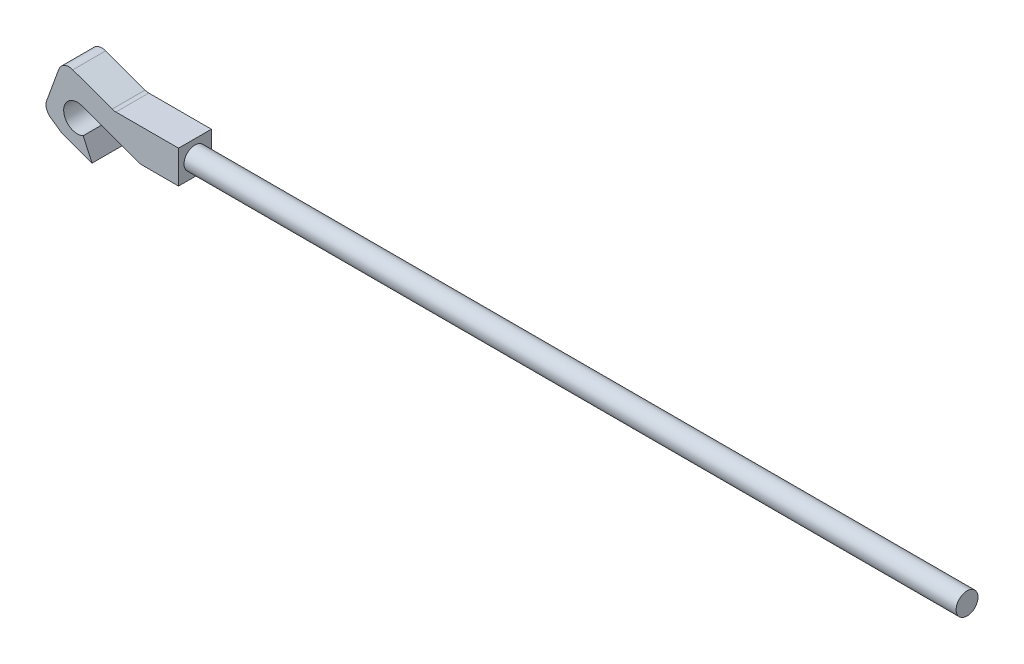
ISO-10303-21;
HEADER;
FILE_DESCRIPTION(('STEP AP214'),'2;1');
FILE_NAME('part.step','',(''),(''),'','','');
FILE_SCHEMA(('AUTOMOTIVE_DESIGN { 1 0 10303 214 1 1 1 1 }'));
ENDSEC;
DATA;
#1=APPLICATION_CONTEXT('core data for automotive mechanical design processes');
#2=APPLICATION_PROTOCOL_DEFINITION('international standard','automotive_design',2000,#1);
#3=PRODUCT_CONTEXT('',#1,'mechanical');
#4=PRODUCT('Part','Part','',(#3));
#5=PRODUCT_RELATED_PRODUCT_CATEGORY('part','',(#4));
#6=PRODUCT_DEFINITION_FORMATION('','',#4);
#7=PRODUCT_DEFINITION_CONTEXT('part definition',#1,'design');
#8=PRODUCT_DEFINITION('design','',#6,#7);
#9=PRODUCT_DEFINITION_SHAPE('','',#8);
#10=(LENGTH_UNIT() NAMED_UNIT(*) SI_UNIT(.MILLI.,.METRE.));
#11=(NAMED_UNIT(*) PLANE_ANGLE_UNIT() SI_UNIT($,.RADIAN.));
#12=(NAMED_UNIT(*) SI_UNIT($,.STERADIAN.) SOLID_ANGLE_UNIT());
#13=UNCERTAINTY_MEASURE_WITH_UNIT(LENGTH_MEASURE(1.E-05),#10,'distance_accuracy_value','');
#14=(GEOMETRIC_REPRESENTATION_CONTEXT(3) GLOBAL_UNCERTAINTY_ASSIGNED_CONTEXT((#13)) GLOBAL_UNIT_ASSIGNED_CONTEXT((#10,
#11,#12)) REPRESENTATION_CONTEXT('',''));
#15=CARTESIAN_POINT('',(0.,0.,0.));
#16=DIRECTION('',(0.,0.,1.));
#17=DIRECTION('',(1.,0.,0.));
#18=AXIS2_PLACEMENT_3D('',#15,#16,#17);
#19=CARTESIAN_POINT('',(-516.930591899167,74.9866588302387,-76.2));
#20=DIRECTION('',(1.,0.,0.));
#21=DIRECTION('',(0.,0.,-1.));
#22=AXIS2_PLACEMENT_3D('',#19,#20,#21);
#23=PLANE('',#22);
#24=CARTESIAN_POINT('',(-516.930591899167,-1.21334116976135,0.));
#25=DIRECTION('',(1.,0.,0.));
#26=DIRECTION('',(0.,0.,-1.));
#27=AXIS2_PLACEMENT_3D('',#24,#25,#26);
#28=CIRCLE('',#27,50.8);
#29=CARTESIAN_POINT('',(-516.930591899167,-1.21334116976135,50.8));
#30=VERTEX_POINT('',#29);
#31=EDGE_CURVE('E50',#30,#30,#28,.T.);
#32=ORIENTED_EDGE('',*,*,#31,.F.);
#33=EDGE_LOOP('',(#32));
#34=FACE_BOUND('',#33,.T.);
#35=DIRECTION('',(0.,1.,0.));
#36=VECTOR('',#35,1.);
#37=CARTESIAN_POINT('',(-516.930591899167,74.9866588302387,76.2));
#38=LINE('',#37,#36);
#39=CARTESIAN_POINT('',(-516.930591899167,-77.4133411697614,76.2));
#40=VERTEX_POINT('',#39);
#41=CARTESIAN_POINT('',(-516.930591899167,74.9866588302387,76.2));
#42=VERTEX_POINT('',#41);
#43=EDGE_CURVE('E188',#40,#42,#38,.T.);
#44=ORIENTED_EDGE('',*,*,#43,.F.);
#45=DIRECTION('',(0.,0.,1.));
#46=VECTOR('',#45,1.);
#47=CARTESIAN_POINT('',(-516.930591899167,-77.4133411697614,-76.2));
#48=LINE('',#47,#46);
#49=CARTESIAN_POINT('',(-516.930591899167,-77.4133411697614,-76.2));
#50=VERTEX_POINT('',#49);
#51=EDGE_CURVE('E64',#50,#40,#48,.T.);
#52=ORIENTED_EDGE('',*,*,#51,.F.);
#53=DIRECTION('',(0.,1.,0.));
#54=VECTOR('',#53,1.);
#55=CARTESIAN_POINT('',(-516.930591899167,74.9866588302387,-76.2));
#56=LINE('',#55,#54);
#57=CARTESIAN_POINT('',(-516.930591899167,74.9866588302387,-76.2));
#58=VERTEX_POINT('',#57);
#59=EDGE_CURVE('E241',#50,#58,#56,.T.);
#60=ORIENTED_EDGE('',*,*,#59,.T.);
#61=DIRECTION('',(0.,0.,1.));
#62=VECTOR('',#61,1.);
#63=CARTESIAN_POINT('',(-516.930591899167,74.9866588302387,-76.2));
#64=LINE('',#63,#62);
#65=EDGE_CURVE('E123',#58,#42,#64,.T.);
#66=ORIENTED_EDGE('',*,*,#65,.T.);
#67=EDGE_LOOP('',(#44,#52,#60,#66));
#68=FACE_BOUND('',#67,.T.);
#69=ADVANCED_FACE('F46',(#34,#68),#23,.T.);
#70=CARTESIAN_POINT('',(-516.930591899167,-77.4133411697614,-76.2));
#71=DIRECTION('',(0.,-1.,0.));
#72=DIRECTION('',(0.,0.,-1.));
#73=AXIS2_PLACEMENT_3D('',#70,#71,#72);
#74=PLANE('',#73);
#75=DIRECTION('',(1.,0.,0.));
#76=VECTOR('',#75,1.);
#77=CARTESIAN_POINT('',(-516.930591899167,-77.4133411697614,76.2));
#78=LINE('',#77,#76);
#79=CARTESIAN_POINT('',(-685.773181279177,-77.4133411697614,76.2));
#80=VERTEX_POINT('',#79);
#81=EDGE_CURVE('E237',#80,#40,#78,.T.);
#82=ORIENTED_EDGE('',*,*,#81,.F.);
#83=DIRECTION('',(0.,0.,1.));
#84=VECTOR('',#83,1.);
#85=CARTESIAN_POINT('',(-685.773181279177,-77.4133411697614,-76.2));
#86=LINE('',#85,#84);
#87=CARTESIAN_POINT('',(-685.773181279177,-77.4133411697614,-76.2));
#88=VERTEX_POINT('',#87);
#89=EDGE_CURVE('E111',#88,#80,#86,.T.);
#90=ORIENTED_EDGE('',*,*,#89,.F.);
#91=DIRECTION('',(1.,0.,0.));
#92=VECTOR('',#91,1.);
#93=CARTESIAN_POINT('',(-516.930591899167,-77.4133411697614,-76.2));
#94=LINE('',#93,#92);
#95=EDGE_CURVE('E174',#88,#50,#94,.T.);
#96=ORIENTED_EDGE('',*,*,#95,.T.);
#97=ORIENTED_EDGE('',*,*,#51,.T.);
#98=EDGE_LOOP('',(#82,#90,#96,#97));
#99=FACE_BOUND('',#98,.T.);
#100=ADVANCED_FACE('F280',(#99),#74,.T.);
#101=CARTESIAN_POINT('',(-685.773181279177,-26.6133411697613,-76.2));
#102=DIRECTION('',(0.,0.,1.));
#103=DIRECTION('',(1.,0.,0.));
#104=AXIS2_PLACEMENT_3D('',#101,#102,#103);
#105=CYLINDRICAL_SURFACE('',#104,50.8);
#106=CARTESIAN_POINT('',(-685.773181279177,-26.6133411697613,76.2));
#107=DIRECTION('',(0.,0.,1.));
#108=DIRECTION('',(-1.,0.,0.));
#109=AXIS2_PLACEMENT_3D('',#106,#107,#108);
#110=CIRCLE('',#109,50.8);
#111=CARTESIAN_POINT('',(-703.147804560121,-74.3497263056856,76.2));
#112=VERTEX_POINT('',#111);
#113=EDGE_CURVE('E160',#112,#80,#110,.T.);
#114=ORIENTED_EDGE('',*,*,#113,.F.);
#115=DIRECTION('',(0.,0.,1.));
#116=VECTOR('',#115,1.);
#117=CARTESIAN_POINT('',(-703.147804560121,-74.3497263056856,-76.2));
#118=LINE('',#117,#116);
#119=CARTESIAN_POINT('',(-703.147804560121,-74.3497263056856,-76.2));
#120=VERTEX_POINT('',#119);
#121=EDGE_CURVE('E155',#120,#112,#118,.T.);
#122=ORIENTED_EDGE('',*,*,#121,.F.);
#123=CARTESIAN_POINT('',(-685.773181279177,-26.6133411697613,-76.2));
#124=DIRECTION('',(0.,0.,1.));
#125=DIRECTION('',(-1.,0.,0.));
#126=AXIS2_PLACEMENT_3D('',#123,#124,#125);
#127=CIRCLE('',#126,50.8);
#128=EDGE_CURVE('E158',#120,#88,#127,.T.);
#129=ORIENTED_EDGE('',*,*,#128,.T.);
#130=ORIENTED_EDGE('',*,*,#89,.T.);
#131=EDGE_LOOP('',(#114,#122,#129,#130));
#132=FACE_BOUND('',#131,.T.);
#133=ADVANCED_FACE('F157',(#132),#105,.T.);
#134=CARTESIAN_POINT('',(-964.510784827192,20.7786188506314,-76.2));
#135=DIRECTION('',(-0.342020143325664,-0.93969262078591,0.));
#136=DIRECTION('',(0.93969262078591,-0.342020143325664,0.));
#137=AXIS2_PLACEMENT_3D('',#134,#135,#136);
#138=PLANE('',#137);
#139=DIRECTION('',(0.93969262078591,-0.342020143325664,0.));
#140=VECTOR('',#139,1.);
#141=CARTESIAN_POINT('',(-964.510784827192,20.7786188506314,76.2));
#142=LINE('',#141,#140);
#143=CARTESIAN_POINT('',(-964.510784827192,20.7786188506314,76.2));
#144=VERTEX_POINT('',#143);
#145=EDGE_CURVE('E232',#144,#112,#142,.T.);
#146=ORIENTED_EDGE('',*,*,#145,.F.);
#147=DIRECTION('',(0.,0.,1.));
#148=VECTOR('',#147,1.);
#149=CARTESIAN_POINT('',(-964.510784827192,20.7786188506314,-76.2));
#150=LINE('',#149,#148);
#151=CARTESIAN_POINT('',(-964.510784827192,20.7786188506314,-76.2));
#152=VERTEX_POINT('',#151);
#153=EDGE_CURVE('E166',#152,#144,#150,.T.);
#154=ORIENTED_EDGE('',*,*,#153,.F.);
#155=DIRECTION('',(0.93969262078591,-0.342020143325664,0.));
#156=VECTOR('',#155,1.);
#157=CARTESIAN_POINT('',(-964.510784827192,20.7786188506314,-76.2));
#158=LINE('',#157,#156);
#159=EDGE_CURVE('E172',#152,#120,#158,.T.);
#160=ORIENTED_EDGE('',*,*,#159,.T.);
#161=ORIENTED_EDGE('',*,*,#121,.T.);
#162=EDGE_LOOP('',(#146,#154,#160,#161));
#163=FACE_BOUND('',#162,.T.);
#164=ADVANCED_FACE('F177',(#163),#138,.T.);
#165=CARTESIAN_POINT('',(-986.229063928371,-38.891862569274,-76.2));
#166=DIRECTION('',(0.,0.,1.));
#167=DIRECTION('',(1.,0.,0.));
#168=AXIS2_PLACEMENT_3D('',#165,#166,#167);
#169=CYLINDRICAL_SURFACE('',#168,63.5000000000001);
#170=CARTESIAN_POINT('',(-986.229063928371,-38.891862569274,76.2));
#171=DIRECTION('',(0.,0.,-1.));
#172=DIRECTION('',(1.,0.,0.));
#173=AXIS2_PLACEMENT_3D('',#170,#171,#172);
#174=CIRCLE('',#173,63.5000000000001);
#175=CARTESIAN_POINT('',(-959.392804307836,-96.4424070461009,76.2));
#176=VERTEX_POINT('',#175);
#177=EDGE_CURVE('E228',#176,#144,#174,.T.);
#178=ORIENTED_EDGE('',*,*,#177,.F.);
#179=DIRECTION('',(0.,0.,1.));
#180=VECTOR('',#179,1.);
#181=CARTESIAN_POINT('',(-959.392804307836,-96.4424070461009,-76.2));
#182=LINE('',#181,#180);
#183=CARTESIAN_POINT('',(-959.392804307836,-96.4424070461009,-76.2));
#184=VERTEX_POINT('',#183);
#185=EDGE_CURVE('E248',#184,#176,#182,.T.);
#186=ORIENTED_EDGE('',*,*,#185,.F.);
#187=CARTESIAN_POINT('',(-986.229063928371,-38.891862569274,-76.2));
#188=DIRECTION('',(0.,0.,-1.));
#189=DIRECTION('',(1.,0.,0.));
#190=AXIS2_PLACEMENT_3D('',#187,#188,#189);
#191=CIRCLE('',#190,63.5000000000001);
#192=EDGE_CURVE('E179',#184,#152,#191,.T.);
#193=ORIENTED_EDGE('',*,*,#192,.T.);
#194=ORIENTED_EDGE('',*,*,#153,.T.);
#195=EDGE_LOOP('',(#178,#186,#193,#194));
#196=FACE_BOUND('',#195,.T.);
#197=ADVANCED_FACE('F295',(#196),#169,.F.);
#198=CARTESIAN_POINT('',(-917.815363486112,-185.605516625364,-76.2));
#199=DIRECTION('',(0.906307787036645,0.422618261740709,0.));
#200=DIRECTION('',(-0.422618261740709,0.906307787036646,0.));
#201=AXIS2_PLACEMENT_3D('',#198,#199,#200);
#202=PLANE('',#201);
#203=DIRECTION('',(-0.422618261740709,0.906307787036645,0.));
#204=VECTOR('',#203,1.);
#205=CARTESIAN_POINT('',(-917.815363486112,-185.605516625364,76.2));
#206=LINE('',#205,#204);
#207=CARTESIAN_POINT('',(-917.815363486112,-185.605516625364,76.2));
#208=VERTEX_POINT('',#207);
#209=EDGE_CURVE('E224',#208,#176,#206,.T.);
#210=ORIENTED_EDGE('',*,*,#209,.F.);
#211=DIRECTION('',(0.,0.,1.));
#212=VECTOR('',#211,1.);
#213=CARTESIAN_POINT('',(-917.815363486112,-185.605516625364,-76.2));
#214=LINE('',#213,#212);
#215=CARTESIAN_POINT('',(-917.815363486112,-185.605516625364,-76.2));
#216=VERTEX_POINT('',#215);
#217=EDGE_CURVE('E251',#216,#208,#214,.T.);
#218=ORIENTED_EDGE('',*,*,#217,.F.);
#219=DIRECTION('',(-0.422618261740709,0.906307787036645,0.));
#220=VECTOR('',#219,1.);
#221=CARTESIAN_POINT('',(-917.815363486112,-185.605516625364,-76.2));
#222=LINE('',#221,#220);
#223=EDGE_CURVE('E182',#216,#184,#222,.T.);
#224=ORIENTED_EDGE('',*,*,#223,.T.);
#225=ORIENTED_EDGE('',*,*,#185,.T.);
#226=EDGE_LOOP('',(#210,#218,#224,#225));
#227=FACE_BOUND('',#226,.T.);
#228=ADVANCED_FACE('F298',(#227),#202,.T.);
#229=CARTESIAN_POINT('',(-1061.02451889388,-133.481646782533,-76.2));
#230=DIRECTION('',(-0.342020143325663,-0.93969262078591,0.));
#231=DIRECTION('',(0.93969262078591,-0.342020143325664,0.));
#232=AXIS2_PLACEMENT_3D('',#229,#230,#231);
#233=PLANE('',#232);
#234=DIRECTION('',(0.93969262078591,-0.342020143325663,0.));
#235=VECTOR('',#234,1.);
#236=CARTESIAN_POINT('',(-1061.02451889388,-133.481646782533,76.2));
#237=LINE('',#236,#235);
#238=CARTESIAN_POINT('',(-1061.02451889388,-133.481646782533,76.2));
#239=VERTEX_POINT('',#238);
#240=EDGE_CURVE('E220',#239,#208,#237,.T.);
#241=ORIENTED_EDGE('',*,*,#240,.F.);
#242=DIRECTION('',(0.,0.,1.));
#243=VECTOR('',#242,1.);
#244=CARTESIAN_POINT('',(-1061.02451889388,-133.481646782533,-76.2));
#245=LINE('',#244,#243);
#246=CARTESIAN_POINT('',(-1061.02451889388,-133.481646782533,-76.2));
#247=VERTEX_POINT('',#246);
#248=EDGE_CURVE('E254',#247,#239,#245,.T.);
#249=ORIENTED_EDGE('',*,*,#248,.F.);
#250=DIRECTION('',(0.93969262078591,-0.342020143325663,0.));
#251=VECTOR('',#250,1.);
#252=CARTESIAN_POINT('',(-1061.02451889388,-133.481646782533,-76.2));
#253=LINE('',#252,#251);
#254=EDGE_CURVE('E478',#247,#216,#253,.T.);
#255=ORIENTED_EDGE('',*,*,#254,.T.);
#256=ORIENTED_EDGE('',*,*,#217,.T.);
#257=EDGE_LOOP('',(#241,#249,#255,#256));
#258=FACE_BOUND('',#257,.T.);
#259=ADVANCED_FACE('F302',(#258),#233,.T.);
#260=CARTESIAN_POINT('',(-1110.0119461331,-99.1802809521365,-76.2));
#261=DIRECTION('',(-0.573576436351042,-0.819152044288995,0.));
#262=DIRECTION('',(0.819152044288995,-0.573576436351042,0.));
#263=AXIS2_PLACEMENT_3D('',#260,#261,#262);
#264=PLANE('',#263);
#265=DIRECTION('',(0.819152044288995,-0.573576436351042,0.));
#266=VECTOR('',#265,1.);
#267=CARTESIAN_POINT('',(-1110.0119461331,-99.1802809521365,76.2));
#268=LINE('',#267,#266);
#269=CARTESIAN_POINT('',(-1110.0119461331,-99.1802809521365,76.2));
#270=VERTEX_POINT('',#269);
#271=EDGE_CURVE('E216',#270,#239,#268,.T.);
#272=ORIENTED_EDGE('',*,*,#271,.F.);
#273=DIRECTION('',(0.,0.,1.));
#274=VECTOR('',#273,1.);
#275=CARTESIAN_POINT('',(-1110.0119461331,-99.1802809521365,-76.2));
#276=LINE('',#275,#274);
#277=CARTESIAN_POINT('',(-1110.0119461331,-99.1802809521365,-76.2));
#278=VERTEX_POINT('',#277);
#279=EDGE_CURVE('E257',#278,#270,#276,.T.);
#280=ORIENTED_EDGE('',*,*,#279,.F.);
#281=DIRECTION('',(0.819152044288995,-0.573576436351042,0.));
#282=VECTOR('',#281,1.);
#283=CARTESIAN_POINT('',(-1110.0119461331,-99.1802809521365,-76.2));
#284=LINE('',#283,#282);
#285=EDGE_CURVE('E471',#278,#247,#284,.T.);
#286=ORIENTED_EDGE('',*,*,#285,.T.);
#287=ORIENTED_EDGE('',*,*,#248,.T.);
#288=EDGE_LOOP('',(#272,#280,#286,#287));
#289=FACE_BOUND('',#288,.T.);
#290=ADVANCED_FACE('F306',(#289),#264,.T.);
#291=CARTESIAN_POINT('',(-1080.87426316646,-57.5673571022556,-76.2));
#292=DIRECTION('',(0.,0.,1.));
#293=DIRECTION('',(1.,0.,0.));
#294=AXIS2_PLACEMENT_3D('',#291,#292,#293);
#295=CYLINDRICAL_SURFACE('',#294,50.8);
#296=CARTESIAN_POINT('',(-1080.87426316646,-57.5673571022556,76.2));
#297=DIRECTION('',(0.,0.,1.));
#298=DIRECTION('',(1.,0.,0.));
#299=AXIS2_PLACEMENT_3D('',#296,#297,#298);
#300=CIRCLE('',#299,50.8);
#301=CARTESIAN_POINT('',(-1128.61064830239,-40.1927338213119,76.2));
#302=VERTEX_POINT('',#301);
#303=EDGE_CURVE('E212',#302,#270,#300,.T.);
#304=ORIENTED_EDGE('',*,*,#303,.F.);
#305=DIRECTION('',(0.,0.,1.));
#306=VECTOR('',#305,1.);
#307=CARTESIAN_POINT('',(-1128.61064830239,-40.1927338213119,-76.2));
#308=LINE('',#307,#306);
#309=CARTESIAN_POINT('',(-1128.61064830239,-40.1927338213119,-76.2));
#310=VERTEX_POINT('',#309);
#311=EDGE_CURVE('E260',#310,#302,#308,.T.);
#312=ORIENTED_EDGE('',*,*,#311,.F.);
#313=CARTESIAN_POINT('',(-1080.87426316646,-57.5673571022556,-76.2));
#314=DIRECTION('',(0.,0.,1.));
#315=DIRECTION('',(1.,0.,0.));
#316=AXIS2_PLACEMENT_3D('',#313,#314,#315);
#317=CIRCLE('',#316,50.8);
#318=EDGE_CURVE('E467',#310,#278,#317,.T.);
#319=ORIENTED_EDGE('',*,*,#318,.T.);
#320=ORIENTED_EDGE('',*,*,#279,.T.);
#321=EDGE_LOOP('',(#304,#312,#319,#320));
#322=FACE_BOUND('',#321,.T.);
#323=ADVANCED_FACE('F310',(#322),#295,.T.);
#324=CARTESIAN_POINT('',(-1072.44417252805,114.123390099033,-76.2));
#325=DIRECTION('',(-0.93969262078591,0.342020143325663,0.));
#326=DIRECTION('',(-0.342020143325663,-0.93969262078591,0.));
#327=AXIS2_PLACEMENT_3D('',#324,#325,#326);
#328=PLANE('',#327);
#329=DIRECTION('',(-0.342020143325663,-0.93969262078591,0.));
#330=VECTOR('',#329,1.);
#331=CARTESIAN_POINT('',(-1072.44417252805,114.123390099033,76.2));
#332=LINE('',#331,#330);
#333=CARTESIAN_POINT('',(-1072.44417252805,114.123390099033,76.2));
#334=VERTEX_POINT('',#333);
#335=EDGE_CURVE('E208',#334,#302,#332,.T.);
#336=ORIENTED_EDGE('',*,*,#335,.F.);
#337=DIRECTION('',(0.,0.,1.));
#338=VECTOR('',#337,1.);
#339=CARTESIAN_POINT('',(-1072.44417252805,114.123390099033,-76.2));
#340=LINE('',#339,#338);
#341=CARTESIAN_POINT('',(-1072.44417252805,114.123390099033,-76.2));
#342=VERTEX_POINT('',#341);
#343=EDGE_CURVE('E263',#342,#334,#340,.T.);
#344=ORIENTED_EDGE('',*,*,#343,.F.);
#345=DIRECTION('',(-0.342020143325663,-0.93969262078591,0.));
#346=VECTOR('',#345,1.);
#347=CARTESIAN_POINT('',(-1072.44417252805,114.123390099033,-76.2));
#348=LINE('',#347,#346);
#349=EDGE_CURVE('E487',#342,#310,#348,.T.);
#350=ORIENTED_EDGE('',*,*,#349,.T.);
#351=ORIENTED_EDGE('',*,*,#311,.T.);
#352=EDGE_LOOP('',(#336,#344,#350,#351));
#353=FACE_BOUND('',#352,.T.);
#354=ADVANCED_FACE('F314',(#353),#328,.T.);
#355=CARTESIAN_POINT('',(-1024.70778739213,96.7487668180891,-76.2));
#356=DIRECTION('',(0.,0.,1.));
#357=DIRECTION('',(1.,0.,0.));
#358=AXIS2_PLACEMENT_3D('',#355,#356,#357);
#359=CYLINDRICAL_SURFACE('',#358,50.8);
#360=CARTESIAN_POINT('',(-1024.70778739213,96.7487668180891,76.2));
#361=DIRECTION('',(0.,0.,1.));
#362=DIRECTION('',(1.,0.,0.));
#363=AXIS2_PLACEMENT_3D('',#360,#361,#362);
#364=CIRCLE('',#363,50.8);
#365=CARTESIAN_POINT('',(-1007.33316411118,144.485151954013,76.2));
#366=VERTEX_POINT('',#365);
#367=EDGE_CURVE('E204',#366,#334,#364,.T.);
#368=ORIENTED_EDGE('',*,*,#367,.F.);
#369=DIRECTION('',(0.,0.,1.));
#370=VECTOR('',#369,1.);
#371=CARTESIAN_POINT('',(-1007.33316411118,144.485151954013,-76.2));
#372=LINE('',#371,#370);
#373=CARTESIAN_POINT('',(-1007.33316411118,144.485151954013,-76.2));
#374=VERTEX_POINT('',#373);
#375=EDGE_CURVE('E266',#374,#366,#372,.T.);
#376=ORIENTED_EDGE('',*,*,#375,.F.);
#377=CARTESIAN_POINT('',(-1024.70778739213,96.7487668180891,-76.2));
#378=DIRECTION('',(0.,0.,1.));
#379=DIRECTION('',(1.,0.,0.));
#380=AXIS2_PLACEMENT_3D('',#377,#378,#379);
#381=CIRCLE('',#380,50.8);
#382=EDGE_CURVE('E460',#374,#342,#381,.T.);
#383=ORIENTED_EDGE('',*,*,#382,.T.);
#384=ORIENTED_EDGE('',*,*,#343,.T.);
#385=EDGE_LOOP('',(#368,#376,#383,#384));
#386=FACE_BOUND('',#385,.T.);
#387=ADVANCED_FACE('F318',(#386),#359,.T.);
#388=CARTESIAN_POINT('',(-824.804836228439,78.0502736943145,-76.2));
#389=DIRECTION('',(0.342020143325664,0.93969262078591,0.));
#390=DIRECTION('',(-0.93969262078591,0.342020143325664,0.));
#391=AXIS2_PLACEMENT_3D('',#388,#389,#390);
#392=PLANE('',#391);
#393=DIRECTION('',(-0.93969262078591,0.342020143325664,0.));
#394=VECTOR('',#393,1.);
#395=CARTESIAN_POINT('',(-824.804836228439,78.0502736943145,76.2));
#396=LINE('',#395,#394);
#397=CARTESIAN_POINT('',(-824.804836228439,78.0502736943145,76.2));
#398=VERTEX_POINT('',#397);
#399=EDGE_CURVE('E200',#398,#366,#396,.T.);
#400=ORIENTED_EDGE('',*,*,#399,.F.);
#401=DIRECTION('',(0.,0.,1.));
#402=VECTOR('',#401,1.);
#403=CARTESIAN_POINT('',(-824.804836228439,78.0502736943145,-76.2));
#404=LINE('',#403,#402);
#405=CARTESIAN_POINT('',(-824.804836228439,78.0502736943145,-76.2));
#406=VERTEX_POINT('',#405);
#407=EDGE_CURVE('E269',#406,#398,#404,.T.);
#408=ORIENTED_EDGE('',*,*,#407,.F.);
#409=DIRECTION('',(-0.93969262078591,0.342020143325664,0.));
#410=VECTOR('',#409,1.);
#411=CARTESIAN_POINT('',(-824.804836228439,78.0502736943145,-76.2));
#412=LINE('',#411,#410);
#413=EDGE_CURVE('E456',#406,#374,#412,.T.);
#414=ORIENTED_EDGE('',*,*,#413,.T.);
#415=ORIENTED_EDGE('',*,*,#375,.T.);
#416=EDGE_LOOP('',(#400,#408,#414,#415));
#417=FACE_BOUND('',#416,.T.);
#418=ADVANCED_FACE('F322',(#417),#392,.T.);
#419=CARTESIAN_POINT('',(-807.430212947496,125.786658830239,-76.2));
#420=DIRECTION('',(0.,0.,1.));
#421=DIRECTION('',(1.,0.,0.));
#422=AXIS2_PLACEMENT_3D('',#419,#420,#421);
#423=CYLINDRICAL_SURFACE('',#422,50.8);
#424=CARTESIAN_POINT('',(-807.430212947496,125.786658830239,76.2));
#425=DIRECTION('',(0.,0.,-1.));
#426=DIRECTION('',(1.,0.,0.));
#427=AXIS2_PLACEMENT_3D('',#424,#425,#426);
#428=CIRCLE('',#427,50.8);
#429=CARTESIAN_POINT('',(-807.430212947495,74.9866588302387,76.2));
#430=VERTEX_POINT('',#429);
#431=EDGE_CURVE('E196',#430,#398,#428,.T.);
#432=ORIENTED_EDGE('',*,*,#431,.F.);
#433=DIRECTION('',(0.,0.,1.));
#434=VECTOR('',#433,1.);
#435=CARTESIAN_POINT('',(-807.430212947495,74.9866588302387,-76.2));
#436=LINE('',#435,#434);
#437=CARTESIAN_POINT('',(-807.430212947495,74.9866588302387,-76.2));
#438=VERTEX_POINT('',#437);
#439=EDGE_CURVE('E272',#438,#430,#436,.T.);
#440=ORIENTED_EDGE('',*,*,#439,.F.);
#441=CARTESIAN_POINT('',(-807.430212947496,125.786658830239,-76.2));
#442=DIRECTION('',(0.,0.,-1.));
#443=DIRECTION('',(1.,0.,0.));
#444=AXIS2_PLACEMENT_3D('',#441,#442,#443);
#445=CIRCLE('',#444,50.8);
#446=EDGE_CURVE('E494',#438,#406,#445,.T.);
#447=ORIENTED_EDGE('',*,*,#446,.T.);
#448=ORIENTED_EDGE('',*,*,#407,.T.);
#449=EDGE_LOOP('',(#432,#440,#447,#448));
#450=FACE_BOUND('',#449,.T.);
#451=ADVANCED_FACE('F326',(#450),#423,.F.);
#452=CARTESIAN_POINT('',(-807.430212947495,74.9866588302387,-76.2));
#453=DIRECTION('',(0.,1.,0.));
#454=DIRECTION('',(0.,0.,1.));
#455=AXIS2_PLACEMENT_3D('',#452,#453,#454);
#456=PLANE('',#455);
#457=DIRECTION('',(-1.,0.,0.));
#458=VECTOR('',#457,1.);
#459=CARTESIAN_POINT('',(-807.430212947495,74.9866588302387,76.2));
#460=LINE('',#459,#458);
#461=EDGE_CURVE('E192',#42,#430,#460,.T.);
#462=ORIENTED_EDGE('',*,*,#461,.F.);
#463=ORIENTED_EDGE('',*,*,#65,.F.);
#464=DIRECTION('',(-1.,0.,0.));
#465=VECTOR('',#464,1.);
#466=CARTESIAN_POINT('',(-807.430212947495,74.9866588302387,-76.2));
#467=LINE('',#466,#465);
#468=EDGE_CURVE('E497',#58,#438,#467,.T.);
#469=ORIENTED_EDGE('',*,*,#468,.T.);
#470=ORIENTED_EDGE('',*,*,#439,.T.);
#471=EDGE_LOOP('',(#462,#463,#469,#470));
#472=FACE_BOUND('',#471,.T.);
#473=ADVANCED_FACE('F276',(#472),#456,.T.);
#474=CARTESIAN_POINT('',(-685.773181279177,-26.6133411697613,-76.2));
#475=DIRECTION('',(0.,0.,-1.));
#476=DIRECTION('',(-1.,0.,0.));
#477=AXIS2_PLACEMENT_3D('',#474,#475,#476);
#478=PLANE('',#477);
#479=ORIENTED_EDGE('',*,*,#59,.F.);
#480=ORIENTED_EDGE('',*,*,#95,.F.);
#481=ORIENTED_EDGE('',*,*,#128,.F.);
#482=ORIENTED_EDGE('',*,*,#159,.F.);
#483=ORIENTED_EDGE('',*,*,#192,.F.);
#484=ORIENTED_EDGE('',*,*,#223,.F.);
#485=ORIENTED_EDGE('',*,*,#254,.F.);
#486=ORIENTED_EDGE('',*,*,#285,.F.);
#487=ORIENTED_EDGE('',*,*,#318,.F.);
#488=ORIENTED_EDGE('',*,*,#349,.F.);
#489=ORIENTED_EDGE('',*,*,#382,.F.);
#490=ORIENTED_EDGE('',*,*,#413,.F.);
#491=ORIENTED_EDGE('',*,*,#446,.F.);
#492=ORIENTED_EDGE('',*,*,#468,.F.);
#493=EDGE_LOOP('',(#479,#480,#481,#482,#483,#484,#485,#486,#487,#488,#489,#490,#491,#492));
#494=FACE_BOUND('',#493,.T.);
#495=ADVANCED_FACE('F170',(#494),#478,.T.);
#496=CARTESIAN_POINT('',(-685.773181279177,-26.6133411697613,76.2));
#497=DIRECTION('',(0.,0.,-1.));
#498=DIRECTION('',(-1.,0.,0.));
#499=AXIS2_PLACEMENT_3D('',#496,#497,#498);
#500=PLANE('',#499);
#501=ORIENTED_EDGE('',*,*,#43,.T.);
#502=ORIENTED_EDGE('',*,*,#461,.T.);
#503=ORIENTED_EDGE('',*,*,#431,.T.);
#504=ORIENTED_EDGE('',*,*,#399,.T.);
#505=ORIENTED_EDGE('',*,*,#367,.T.);
#506=ORIENTED_EDGE('',*,*,#335,.T.);
#507=ORIENTED_EDGE('',*,*,#303,.T.);
#508=ORIENTED_EDGE('',*,*,#271,.T.);
#509=ORIENTED_EDGE('',*,*,#240,.T.);
#510=ORIENTED_EDGE('',*,*,#209,.T.);
#511=ORIENTED_EDGE('',*,*,#177,.T.);
#512=ORIENTED_EDGE('',*,*,#145,.T.);
#513=ORIENTED_EDGE('',*,*,#113,.T.);
#514=ORIENTED_EDGE('',*,*,#81,.T.);
#515=EDGE_LOOP('',(#501,#502,#503,#504,#505,#506,#507,#508,#509,#510,#511,#512,#513,#514));
#516=FACE_BOUND('',#515,.T.);
#517=ADVANCED_FACE('F279',(#516),#500,.F.);
#518=CARTESIAN_POINT('',(3064.46940810083,-1.21334116976135,0.));
#519=DIRECTION('',(-1.,0.,0.));
#520=DIRECTION('',(0.,0.,1.));
#521=AXIS2_PLACEMENT_3D('',#518,#519,#520);
#522=CYLINDRICAL_SURFACE('',#521,50.8);
#523=CARTESIAN_POINT('',(3064.46940810083,-1.21334116976135,0.));
#524=DIRECTION('',(1.,0.,0.));
#525=DIRECTION('',(0.,0.,-1.));
#526=AXIS2_PLACEMENT_3D('',#523,#524,#525);
#527=CIRCLE('',#526,50.8);
#528=CARTESIAN_POINT('',(3064.46940810083,-1.21334116976135,50.8));
#529=VERTEX_POINT('',#528);
#530=EDGE_CURVE('E12',#529,#529,#527,.T.);
#531=CARTESIAN_POINT('',(-516.930591899167,-1.21334116976135,50.8));
#532=CARTESIAN_POINT('',(-479.624341899167,-1.21334116976135,50.8));
#533=CARTESIAN_POINT('',(-442.318091899167,-1.21334116976135,50.8));
#534=CARTESIAN_POINT('',(-367.705591899167,-1.21334116976135,50.8));
#535=CARTESIAN_POINT('',(-330.399341899167,-1.21334116976135,50.8));
#536=CARTESIAN_POINT('',(-255.786841899167,-1.21334116976135,50.8));
#537=CARTESIAN_POINT('',(-218.480591899167,-1.21334116976135,50.8));
#538=CARTESIAN_POINT('',(-143.868091899167,-1.21334116976135,50.8));
#539=CARTESIAN_POINT('',(-106.561841899167,-1.21334116976135,50.8));
#540=CARTESIAN_POINT('',(-31.9493418991666,-1.21334116976135,50.8));
#541=CARTESIAN_POINT('',(5.35690810083342,-1.21334116976135,50.8));
#542=CARTESIAN_POINT('',(79.9694081008333,-1.21334116976135,50.8));
#543=CARTESIAN_POINT('',(117.275658100833,-1.21334116976135,50.8));
#544=CARTESIAN_POINT('',(191.888158100833,-1.21334116976135,50.8));
#545=CARTESIAN_POINT('',(229.194408100833,-1.21334116976135,50.8));
#546=CARTESIAN_POINT('',(303.806908100833,-1.21334116976135,50.8));
#547=CARTESIAN_POINT('',(341.113158100833,-1.21334116976135,50.8));
#548=CARTESIAN_POINT('',(415.725658100833,-1.21334116976135,50.8));
#549=CARTESIAN_POINT('',(453.031908100833,-1.21334116976135,50.8));
#550=CARTESIAN_POINT('',(527.644408100833,-1.21334116976135,50.8));
#551=CARTESIAN_POINT('',(564.950658100833,-1.21334116976135,50.8));
#552=CARTESIAN_POINT('',(639.563158100833,-1.21334116976135,50.8));
#553=CARTESIAN_POINT('',(676.869408100833,-1.21334116976135,50.8));
#554=CARTESIAN_POINT('',(751.481908100833,-1.21334116976135,50.8));
#555=CARTESIAN_POINT('',(788.788158100833,-1.21334116976135,50.8));
#556=CARTESIAN_POINT('',(863.400658100833,-1.21334116976135,50.8));
#557=CARTESIAN_POINT('',(900.706908100833,-1.21334116976135,50.8));
#558=CARTESIAN_POINT('',(975.319408100833,-1.21334116976135,50.8));
#559=CARTESIAN_POINT('',(1012.62565810083,-1.21334116976135,50.8));
#560=CARTESIAN_POINT('',(1087.23815810083,-1.21334116976135,50.8));
#561=CARTESIAN_POINT('',(1124.54440810083,-1.21334116976135,50.8));
#562=CARTESIAN_POINT('',(1199.15690810083,-1.21334116976135,50.8));
#563=CARTESIAN_POINT('',(1236.46315810083,-1.21334116976135,50.8));
#564=CARTESIAN_POINT('',(1311.07565810083,-1.21334116976135,50.8));
#565=CARTESIAN_POINT('',(1348.38190810083,-1.21334116976135,50.8));
#566=CARTESIAN_POINT('',(1422.99440810083,-1.21334116976135,50.8));
#567=CARTESIAN_POINT('',(1460.30065810083,-1.21334116976135,50.8));
#568=CARTESIAN_POINT('',(1534.91315810083,-1.21334116976135,50.8));
#569=CARTESIAN_POINT('',(1572.21940810083,-1.21334116976135,50.8));
#570=CARTESIAN_POINT('',(1646.83190810083,-1.21334116976135,50.8));
#571=CARTESIAN_POINT('',(1684.13815810083,-1.21334116976135,50.8));
#572=CARTESIAN_POINT('',(1758.75065810083,-1.21334116976135,50.8));
#573=CARTESIAN_POINT('',(1796.05690810083,-1.21334116976135,50.8));
#574=CARTESIAN_POINT('',(1870.66940810083,-1.21334116976135,50.8));
#575=CARTESIAN_POINT('',(1907.97565810083,-1.21334116976135,50.8));
#576=CARTESIAN_POINT('',(1982.58815810083,-1.21334116976135,50.8));
#577=CARTESIAN_POINT('',(2019.89440810083,-1.21334116976135,50.8));
#578=CARTESIAN_POINT('',(2094.50690810083,-1.21334116976135,50.8));
#579=CARTESIAN_POINT('',(2131.81315810083,-1.21334116976135,50.8));
#580=CARTESIAN_POINT('',(2206.42565810083,-1.21334116976135,50.8));
#581=CARTESIAN_POINT('',(2243.73190810083,-1.21334116976135,50.8));
#582=CARTESIAN_POINT('',(2318.34440810083,-1.21334116976135,50.8));
#583=CARTESIAN_POINT('',(2355.65065810083,-1.21334116976135,50.8));
#584=CARTESIAN_POINT('',(2430.26315810083,-1.21334116976135,50.8));
#585=CARTESIAN_POINT('',(2467.56940810083,-1.21334116976135,50.8));
#586=CARTESIAN_POINT('',(2542.18190810083,-1.21334116976135,50.8));
#587=CARTESIAN_POINT('',(2579.48815810083,-1.21334116976135,50.8));
#588=CARTESIAN_POINT('',(2654.10065810083,-1.21334116976135,50.8));
#589=CARTESIAN_POINT('',(2691.40690810083,-1.21334116976135,50.8));
#590=CARTESIAN_POINT('',(2766.01940810083,-1.21334116976135,50.8));
#591=CARTESIAN_POINT('',(2803.32565810083,-1.21334116976135,50.8));
#592=CARTESIAN_POINT('',(2877.93815810083,-1.21334116976135,50.8));
#593=CARTESIAN_POINT('',(2915.24440810083,-1.21334116976135,50.8));
#594=CARTESIAN_POINT('',(2989.85690810083,-1.21334116976135,50.8));
#595=CARTESIAN_POINT('',(3027.16315810083,-1.21334116976135,50.8));
#596=CARTESIAN_POINT('',(3064.46940810083,-1.21334116976135,50.8));
#597=B_SPLINE_CURVE_WITH_KNOTS('',3,(#531,#532,#533,#534,#535,#536,#537,#538,#539,#540,#541,
#542,#543,#544,#545,#546,#547,#548,#549,#550,#551,#552,#553,#554,#555,#556,#557,#558,#559,#560,
#561,#562,#563,#564,#565,#566,#567,#568,#569,#570,#571,#572,#573,#574,#575,#576,#577,#578,#579,
#580,#581,#582,#583,#584,#585,#586,#587,#588,#589,#590,#591,#592,#593,#594,#595,#596),
.UNSPECIFIED.,.F.,.F.,(4,2,2,2,2,2,2,2,2,2,2,2,2,2,2,2,2,2,2,2,2,2,2,2,2,2,2,2,2,2,2,2,4),(0.,
111.91875,223.8375,335.75625,447.675,559.59375,671.5125,783.43125,895.35,1007.26875,1119.1875,
1231.10625,1343.025,1454.94375,1566.8625,1678.78125,1790.7,1902.61875,2014.5375,2126.45625,
2238.375,2350.29375,2462.2125,2574.13125,2686.05,2797.96875,2909.8875,3021.80625,3133.725,
3245.64375,3357.5625,3469.48125,3581.4),.UNSPECIFIED.);
#598=EDGE_CURVE('BSEAM48',#30,#529,#597,.T.);
#599=ORIENTED_EDGE('',*,*,#31,.T.);
#600=ORIENTED_EDGE('',*,*,#530,.F.);
#601=ORIENTED_EDGE('',*,*,#598,.T.);
#602=ORIENTED_EDGE('',*,*,#598,.F.);
#603=EDGE_LOOP('',(#599,#601,#600,#602));
#604=FACE_BOUND('',#603,.T.);
#605=ADVANCED_FACE('F48',(#604),#522,.T.);
#606=CARTESIAN_POINT('',(3064.46940810083,-1.21334116976135,0.));
#607=DIRECTION('',(1.,0.,0.));
#608=DIRECTION('',(0.,0.,-1.));
#609=AXIS2_PLACEMENT_3D('',#606,#607,#608);
#610=PLANE('',#609);
#611=ORIENTED_EDGE('',*,*,#530,.T.);
#612=EDGE_LOOP('',(#611));
#613=FACE_BOUND('',#612,.T.);
#614=ADVANCED_FACE('F332',(#613),#610,.T.);
#615=CLOSED_SHELL('',(#69,#100,#133,#164,#197,#228,#259,#290,#323,#354,#387,#418,#451,#473,#495,
#517,#605,#614));
#616=MANIFOLD_SOLID_BREP('B2',#615);
#617=ADVANCED_BREP_SHAPE_REPRESENTATION('',(#18,#616),#14);
#618=SHAPE_DEFINITION_REPRESENTATION(#9,#617);
ENDSEC;
END-ISO-10303-21;
